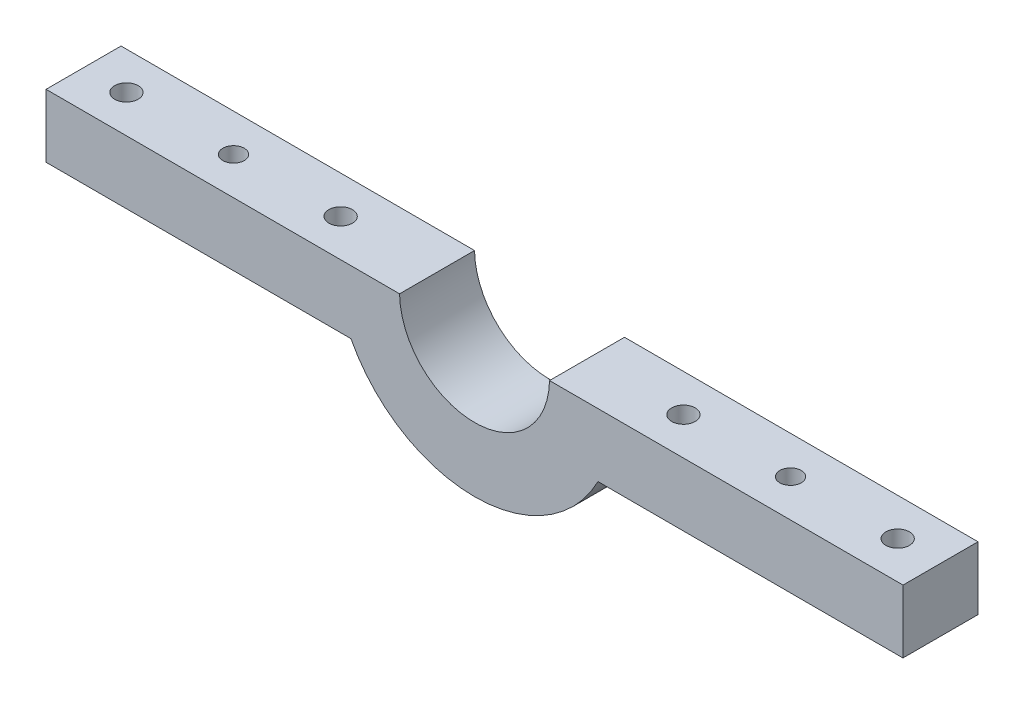
ISO-10303-21;
HEADER;
FILE_DESCRIPTION(('STEP AP214'),'2;1');
FILE_NAME('part.step','',(''),(''),'','','');
FILE_SCHEMA(('AUTOMOTIVE_DESIGN { 1 0 10303 214 1 1 1 1 }'));
ENDSEC;
DATA;
#1=APPLICATION_CONTEXT('core data for automotive mechanical design processes');
#2=APPLICATION_PROTOCOL_DEFINITION('international standard','automotive_design',2000,#1);
#3=PRODUCT_CONTEXT('',#1,'mechanical');
#4=PRODUCT('Part','Part','',(#3));
#5=PRODUCT_RELATED_PRODUCT_CATEGORY('part','',(#4));
#6=PRODUCT_DEFINITION_FORMATION('','',#4);
#7=PRODUCT_DEFINITION_CONTEXT('part definition',#1,'design');
#8=PRODUCT_DEFINITION('design','',#6,#7);
#9=PRODUCT_DEFINITION_SHAPE('','',#8);
#10=(LENGTH_UNIT() NAMED_UNIT(*) SI_UNIT(.MILLI.,.METRE.));
#11=(NAMED_UNIT(*) PLANE_ANGLE_UNIT() SI_UNIT($,.RADIAN.));
#12=(NAMED_UNIT(*) SI_UNIT($,.STERADIAN.) SOLID_ANGLE_UNIT());
#13=UNCERTAINTY_MEASURE_WITH_UNIT(LENGTH_MEASURE(1.E-05),#10,'distance_accuracy_value','');
#14=(GEOMETRIC_REPRESENTATION_CONTEXT(3) GLOBAL_UNCERTAINTY_ASSIGNED_CONTEXT((#13)) GLOBAL_UNIT_ASSIGNED_CONTEXT((#10,
#11,#12)) REPRESENTATION_CONTEXT('',''));
#15=CARTESIAN_POINT('',(0.,0.,0.));
#16=DIRECTION('',(0.,0.,1.));
#17=DIRECTION('',(1.,0.,0.));
#18=AXIS2_PLACEMENT_3D('',#15,#16,#17);
#19=CARTESIAN_POINT('',(0.00272792000566536,-239.807466490866,-35.));
#20=DIRECTION('',(0.,0.,1.));
#21=DIRECTION('',(1.,0.,0.));
#22=AXIS2_PLACEMENT_3D('',#19,#20,#21);
#23=PLANE('',#22);
#24=CARTESIAN_POINT('',(0.00272792000566536,-239.807466490866,-35.));
#25=DIRECTION('',(0.,0.,-1.));
#26=DIRECTION('',(1.,0.,0.));
#27=AXIS2_PLACEMENT_3D('',#24,#25,#26);
#28=CIRCLE('',#27,35.);
#29=CARTESIAN_POINT('',(-0.0972720799945216,-274.807323633431,-35.));
#30=VERTEX_POINT('',#29);
#31=CARTESIAN_POINT('',(-34.9941790972939,-240.27276126033,-35.));
#32=VERTEX_POINT('',#31);
#33=EDGE_CURVE('E143',#30,#32,#28,.T.);
#34=ORIENTED_EDGE('',*,*,#33,.F.);
#35=DIRECTION('',(0.,-1.,0.));
#36=VECTOR('',#35,1.);
#37=CARTESIAN_POINT('',(-0.0972720799945175,-239.807466490866,-35.));
#38=LINE('',#37,#36);
#39=CARTESIAN_POINT('',(-0.0972720799945252,-304.807389567743,-35.));
#40=VERTEX_POINT('',#39);
#41=EDGE_CURVE('E46',#30,#40,#38,.T.);
#42=ORIENTED_EDGE('',*,*,#41,.T.);
#43=CARTESIAN_POINT('',(0.00272792000566536,-239.807466490866,-35.));
#44=DIRECTION('',(0.,0.,1.));
#45=DIRECTION('',(1.,0.,0.));
#46=AXIS2_PLACEMENT_3D('',#43,#44,#45);
#47=CIRCLE('',#46,65.);
#48=CARTESIAN_POINT('',(-57.6898068657538,-269.7502691318,-35.));
#49=VERTEX_POINT('',#48);
#50=EDGE_CURVE('E211',#49,#40,#47,.T.);
#51=ORIENTED_EDGE('',*,*,#50,.F.);
#52=DIRECTION('',(0.999999508293016,-0.000991672187112033,0.));
#53=VECTOR('',#52,1.);
#54=CARTESIAN_POINT('',(-57.6898068657538,-269.7502691318,-35.));
#55=LINE('',#54,#53);
#56=CARTESIAN_POINT('',(-200.026923904211,-269.609117302234,-35.));
#57=VERTEX_POINT('',#56);
#58=EDGE_CURVE('E229',#57,#49,#55,.T.);
#59=ORIENTED_EDGE('',*,*,#58,.F.);
#60=DIRECTION('',(-0.00099167218711209,-0.999999508293016,0.));
#61=VECTOR('',#60,1.);
#62=CARTESIAN_POINT('',(-200.026923904211,-269.609117302234,-35.));
#63=LINE('',#62,#61);
#64=CARTESIAN_POINT('',(-199.997669574691,-240.10913180759,-35.));
#65=VERTEX_POINT('',#64);
#66=EDGE_CURVE('E175',#65,#57,#63,.T.);
#67=ORIENTED_EDGE('',*,*,#66,.F.);
#68=DIRECTION('',(-0.999999508293016,0.000991672187112086,0.));
#69=VECTOR('',#68,1.);
#70=CARTESIAN_POINT('',(-199.997669574691,-240.10913180759,-35.));
#71=LINE('',#70,#69);
#72=EDGE_CURVE('E142',#32,#65,#71,.T.);
#73=ORIENTED_EDGE('',*,*,#72,.F.);
#74=EDGE_LOOP('',(#34,#42,#51,#59,#67,#73));
#75=FACE_BOUND('',#74,.T.);
#76=ADVANCED_FACE('F38',(#75),#23,.F.);
#77=CARTESIAN_POINT('',(-200.026923904211,-269.609117302234,-35.));
#78=DIRECTION('',(-0.999999508293016,0.00099167218711209,0.));
#79=DIRECTION('',(-0.00099167218711209,-0.999999508293016,0.));
#80=AXIS2_PLACEMENT_3D('',#77,#78,#79);
#81=PLANE('',#80);
#82=DIRECTION('',(-0.00099167218711209,-0.999999508293016,0.));
#83=VECTOR('',#82,1.);
#84=CARTESIAN_POINT('',(-200.026923904211,-269.609117302234,0.));
#85=LINE('',#84,#83);
#86=CARTESIAN_POINT('',(-199.997669574691,-240.10913180759,0.));
#87=VERTEX_POINT('',#86);
#88=CARTESIAN_POINT('',(-200.026923904211,-269.609117302234,0.));
#89=VERTEX_POINT('',#88);
#90=EDGE_CURVE('E153',#87,#89,#85,.T.);
#91=ORIENTED_EDGE('',*,*,#90,.F.);
#92=DIRECTION('',(0.,0.,1.));
#93=VECTOR('',#92,1.);
#94=CARTESIAN_POINT('',(-199.997669574691,-240.10913180759,-35.));
#95=LINE('',#94,#93);
#96=EDGE_CURVE('E62',#65,#87,#95,.T.);
#97=ORIENTED_EDGE('',*,*,#96,.F.);
#98=ORIENTED_EDGE('',*,*,#66,.T.);
#99=DIRECTION('',(0.,0.,1.));
#100=VECTOR('',#99,1.);
#101=CARTESIAN_POINT('',(-200.026923904211,-269.609117302234,-35.));
#102=LINE('',#101,#100);
#103=EDGE_CURVE('E101',#57,#89,#102,.T.);
#104=ORIENTED_EDGE('',*,*,#103,.T.);
#105=EDGE_LOOP('',(#91,#97,#98,#104));
#106=FACE_BOUND('',#105,.T.);
#107=ADVANCED_FACE('F40',(#106),#81,.T.);
#108=CARTESIAN_POINT('',(-199.997669574691,-240.10913180759,-35.));
#109=DIRECTION('',(0.000991672187112087,0.999999508293016,0.));
#110=DIRECTION('',(-0.999999508293016,0.000991672187112087,0.));
#111=AXIS2_PLACEMENT_3D('',#108,#109,#110);
#112=PLANE('',#111);
#113=CARTESIAN_POINT('',(-129.99770399418,-240.178548860687,-17.5));
#114=DIRECTION('',(0.000991672187112087,0.999999508293016,0.));
#115=DIRECTION('',(-0.999999508293016,0.000991672187112087,0.));
#116=AXIS2_PLACEMENT_3D('',#113,#114,#115);
#117=CIRCLE('',#116,4.99999999999999);
#118=CARTESIAN_POINT('',(-134.997701535645,-240.173590499752,-17.5));
#119=VERTEX_POINT('',#118);
#120=EDGE_CURVE('E197',#119,#119,#117,.T.);
#121=ORIENTED_EDGE('',*,*,#120,.F.);
#122=EDGE_LOOP('',(#121));
#123=FACE_BOUND('',#122,.T.);
#124=CARTESIAN_POINT('',(-179.997679408831,-240.128965251332,-17.5));
#125=DIRECTION('',(0.000991672187112085,0.999999508293016,0.));
#126=DIRECTION('',(-0.999999508293016,0.000991672187112085,0.));
#127=AXIS2_PLACEMENT_3D('',#124,#125,#126);
#128=CIRCLE('',#127,5.49999999999999);
#129=CARTESIAN_POINT('',(-185.497676704442,-240.123511054303,-17.5));
#130=VERTEX_POINT('',#129);
#131=EDGE_CURVE('E193',#130,#130,#128,.T.);
#132=ORIENTED_EDGE('',*,*,#131,.F.);
#133=EDGE_LOOP('',(#132));
#134=FACE_BOUND('',#133,.T.);
#135=CARTESIAN_POINT('',(-79.9977285795291,-240.228132470043,-17.5));
#136=DIRECTION('',(0.000991672187112085,0.999999508293016,0.));
#137=DIRECTION('',(-0.999999508293016,0.000991672187112085,0.));
#138=AXIS2_PLACEMENT_3D('',#135,#136,#137);
#139=CIRCLE('',#138,5.49999999999999);
#140=CARTESIAN_POINT('',(-85.4977258751407,-240.222678273014,-17.5));
#141=VERTEX_POINT('',#140);
#142=EDGE_CURVE('E192',#141,#141,#139,.T.);
#143=ORIENTED_EDGE('',*,*,#142,.F.);
#144=EDGE_LOOP('',(#143));
#145=FACE_BOUND('',#144,.T.);
#146=DIRECTION('',(-0.999999508293016,0.000991672187112086,0.));
#147=VECTOR('',#146,1.);
#148=CARTESIAN_POINT('',(-199.997669574691,-240.10913180759,0.));
#149=LINE('',#148,#147);
#150=CARTESIAN_POINT('',(-34.9941790972939,-240.27276126033,0.));
#151=VERTEX_POINT('',#150);
#152=EDGE_CURVE('E172',#151,#87,#149,.T.);
#153=ORIENTED_EDGE('',*,*,#152,.F.);
#154=DIRECTION('',(0.,0.,1.));
#155=VECTOR('',#154,1.);
#156=CARTESIAN_POINT('',(-34.9941790972939,-240.27276126033,-35.));
#157=LINE('',#156,#155);
#158=EDGE_CURVE('E131',#32,#151,#157,.T.);
#159=ORIENTED_EDGE('',*,*,#158,.F.);
#160=ORIENTED_EDGE('',*,*,#72,.T.);
#161=ORIENTED_EDGE('',*,*,#96,.T.);
#162=EDGE_LOOP('',(#153,#159,#160,#161));
#163=FACE_BOUND('',#162,.T.);
#164=ADVANCED_FACE('F299',(#123,#134,#145,#163),#112,.T.);
#165=CARTESIAN_POINT('',(0.00272792000566536,-239.807466490866,-35.));
#166=DIRECTION('',(0.,0.,1.));
#167=DIRECTION('',(1.,0.,0.));
#168=AXIS2_PLACEMENT_3D('',#165,#166,#167);
#169=CYLINDRICAL_SURFACE('',#168,35.);
#170=DIRECTION('',(0.,0.,1.));
#171=VECTOR('',#170,1.);
#172=CARTESIAN_POINT('',(-0.0972720799945216,-274.807323633431,-35.));
#173=LINE('',#172,#171);
#174=CARTESIAN_POINT('',(-0.0972720799945216,-274.807323633431,-34.8));
#175=VERTEX_POINT('',#174);
#176=EDGE_CURVE('E265',#30,#175,#173,.T.);
#177=ORIENTED_EDGE('',*,*,#176,.F.);
#178=ORIENTED_EDGE('',*,*,#33,.T.);
#179=ORIENTED_EDGE('',*,*,#158,.T.);
#180=CARTESIAN_POINT('',(0.00272792000566536,-239.807466490866,0.));
#181=DIRECTION('',(0.,0.,-1.));
#182=DIRECTION('',(1.,0.,0.));
#183=AXIS2_PLACEMENT_3D('',#180,#181,#182);
#184=CIRCLE('',#183,35.);
#185=CARTESIAN_POINT('',(34.9986432651181,-240.342171229694,0.));
#186=VERTEX_POINT('',#185);
#187=EDGE_CURVE('E126',#186,#151,#184,.T.);
#188=ORIENTED_EDGE('',*,*,#187,.F.);
#189=DIRECTION('',(0.,0.,1.));
#190=VECTOR('',#189,1.);
#191=CARTESIAN_POINT('',(34.9986432651181,-240.342171229694,-35.));
#192=LINE('',#191,#190);
#193=CARTESIAN_POINT('',(34.9986432651181,-240.342171229694,-35.));
#194=VERTEX_POINT('',#193);
#195=EDGE_CURVE('E120',#194,#186,#192,.T.);
#196=ORIENTED_EDGE('',*,*,#195,.F.);
#197=CARTESIAN_POINT('',(0.102727920005478,-274.807323633431,-35.));
#198=VERTEX_POINT('',#197);
#199=EDGE_CURVE('E124',#194,#198,#28,.T.);
#200=ORIENTED_EDGE('',*,*,#199,.T.);
#201=DIRECTION('',(0.,0.,1.));
#202=VECTOR('',#201,1.);
#203=CARTESIAN_POINT('',(0.102727920005478,-274.807323633431,-35.));
#204=LINE('',#203,#202);
#205=CARTESIAN_POINT('',(0.102727920005478,-274.807323633431,-34.8));
#206=VERTEX_POINT('',#205);
#207=EDGE_CURVE('E53',#206,#198,#204,.F.);
#208=ORIENTED_EDGE('',*,*,#207,.F.);
#209=CARTESIAN_POINT('',(0.00272792000566536,-239.807466490866,-34.8));
#210=DIRECTION('',(0.,0.,1.));
#211=DIRECTION('',(1.,0.,0.));
#212=AXIS2_PLACEMENT_3D('',#209,#210,#211);
#213=CIRCLE('',#212,35.);
#214=EDGE_CURVE('E262',#175,#206,#213,.T.);
#215=ORIENTED_EDGE('',*,*,#214,.F.);
#216=EDGE_LOOP('',(#177,#178,#179,#188,#196,#200,#208,#215));
#217=FACE_BOUND('',#216,.T.);
#218=ADVANCED_FACE('F123',(#217),#169,.F.);
#219=CARTESIAN_POINT('',(34.9986432651181,-240.342171229694,-35.));
#220=DIRECTION('',(0.000991672187112086,0.999999508293016,0.));
#221=DIRECTION('',(-0.999999508293016,0.000991672187112086,0.));
#222=AXIS2_PLACEMENT_3D('',#219,#220,#221);
#223=PLANE('',#222);
#224=CARTESIAN_POINT('',(130.002168162004,-240.436383629337,-17.5));
#225=DIRECTION('',(0.000991672187112086,0.999999508293016,0.));
#226=DIRECTION('',(-0.999999508293016,0.000991672187112086,0.));
#227=AXIS2_PLACEMENT_3D('',#224,#225,#226);
#228=CIRCLE('',#227,4.99999999999999);
#229=CARTESIAN_POINT('',(125.002170620539,-240.431425268401,-17.5));
#230=VERTEX_POINT('',#229);
#231=EDGE_CURVE('E248',#230,#230,#228,.T.);
#232=ORIENTED_EDGE('',*,*,#231,.F.);
#233=EDGE_LOOP('',(#232));
#234=FACE_BOUND('',#233,.T.);
#235=CARTESIAN_POINT('',(80.0021927473534,-240.386800019981,-17.5));
#236=DIRECTION('',(0.000991672187112085,0.999999508293016,0.));
#237=DIRECTION('',(-0.999999508293016,0.000991672187112085,0.));
#238=AXIS2_PLACEMENT_3D('',#235,#236,#237);
#239=CIRCLE('',#238,5.49999999999999);
#240=CARTESIAN_POINT('',(74.5021954517418,-240.381345822952,-17.5));
#241=VERTEX_POINT('',#240);
#242=EDGE_CURVE('E238',#241,#241,#239,.T.);
#243=ORIENTED_EDGE('',*,*,#242,.F.);
#244=EDGE_LOOP('',(#243));
#245=FACE_BOUND('',#244,.T.);
#246=CARTESIAN_POINT('',(180.002143576655,-240.485967238692,-17.5));
#247=DIRECTION('',(0.000991672187112085,0.999999508293016,0.));
#248=DIRECTION('',(-0.999999508293016,0.000991672187112085,0.));
#249=AXIS2_PLACEMENT_3D('',#246,#247,#248);
#250=CIRCLE('',#249,5.49999999999999);
#251=CARTESIAN_POINT('',(174.502146281043,-240.480513041663,-17.5));
#252=VERTEX_POINT('',#251);
#253=EDGE_CURVE('E188',#252,#252,#250,.T.);
#254=ORIENTED_EDGE('',*,*,#253,.F.);
#255=EDGE_LOOP('',(#254));
#256=FACE_BOUND('',#255,.T.);
#257=DIRECTION('',(-0.999999508293016,0.000991672187112086,0.));
#258=VECTOR('',#257,1.);
#259=CARTESIAN_POINT('',(34.9986432651181,-240.342171229694,0.));
#260=LINE('',#259,#258);
#261=CARTESIAN_POINT('',(200.002133742515,-240.505800682434,0.));
#262=VERTEX_POINT('',#261);
#263=EDGE_CURVE('E169',#262,#186,#260,.T.);
#264=ORIENTED_EDGE('',*,*,#263,.F.);
#265=DIRECTION('',(0.,0.,1.));
#266=VECTOR('',#265,1.);
#267=CARTESIAN_POINT('',(200.002133742515,-240.505800682434,-35.));
#268=LINE('',#267,#266);
#269=CARTESIAN_POINT('',(200.002133742515,-240.505800682434,-35.));
#270=VERTEX_POINT('',#269);
#271=EDGE_CURVE('E132',#270,#262,#268,.T.);
#272=ORIENTED_EDGE('',*,*,#271,.F.);
#273=DIRECTION('',(-0.999999508293016,0.000991672187112086,0.));
#274=VECTOR('',#273,1.);
#275=CARTESIAN_POINT('',(34.9986432651181,-240.342171229694,-35.));
#276=LINE('',#275,#274);
#277=EDGE_CURVE('E139',#270,#194,#276,.T.);
#278=ORIENTED_EDGE('',*,*,#277,.T.);
#279=ORIENTED_EDGE('',*,*,#195,.T.);
#280=EDGE_LOOP('',(#264,#272,#278,#279));
#281=FACE_BOUND('',#280,.T.);
#282=ADVANCED_FACE('F145',(#234,#245,#256,#281),#223,.T.);
#283=CARTESIAN_POINT('',(200.002133742515,-240.505800682434,-35.));
#284=DIRECTION('',(0.999999508293016,-0.00099167218711209,0.));
#285=DIRECTION('',(0.00099167218711209,0.999999508293016,0.));
#286=AXIS2_PLACEMENT_3D('',#283,#284,#285);
#287=PLANE('',#286);
#288=DIRECTION('',(0.00099167218711209,0.999999508293016,0.));
#289=VECTOR('',#288,1.);
#290=CARTESIAN_POINT('',(200.002133742515,-240.505800682434,0.));
#291=LINE('',#290,#289);
#292=CARTESIAN_POINT('',(199.972879412995,-270.005786177078,0.));
#293=VERTEX_POINT('',#292);
#294=EDGE_CURVE('E166',#293,#262,#291,.T.);
#295=ORIENTED_EDGE('',*,*,#294,.F.);
#296=DIRECTION('',(0.,0.,1.));
#297=VECTOR('',#296,1.);
#298=CARTESIAN_POINT('',(199.972879412995,-270.005786177078,-35.));
#299=LINE('',#298,#297);
#300=CARTESIAN_POINT('',(199.972879412995,-270.005786177078,-35.));
#301=VERTEX_POINT('',#300);
#302=EDGE_CURVE('E179',#301,#293,#299,.T.);
#303=ORIENTED_EDGE('',*,*,#302,.F.);
#304=DIRECTION('',(0.00099167218711209,0.999999508293016,0.));
#305=VECTOR('',#304,1.);
#306=CARTESIAN_POINT('',(200.002133742515,-240.505800682434,-35.));
#307=LINE('',#306,#305);
#308=EDGE_CURVE('E146',#301,#270,#307,.T.);
#309=ORIENTED_EDGE('',*,*,#308,.T.);
#310=ORIENTED_EDGE('',*,*,#271,.T.);
#311=EDGE_LOOP('',(#295,#303,#309,#310));
#312=FACE_BOUND('',#311,.T.);
#313=ADVANCED_FACE('F332',(#312),#287,.T.);
#314=CARTESIAN_POINT('',(199.972879412995,-270.005786177078,-35.));
#315=DIRECTION('',(-0.000991672187112033,-0.999999508293016,0.));
#316=DIRECTION('',(0.999999508293016,-0.000991672187112033,0.));
#317=AXIS2_PLACEMENT_3D('',#314,#315,#316);
#318=PLANE('',#317);
#319=CARTESIAN_POINT('',(129.972913832484,-269.936369123981,-17.5));
#320=DIRECTION('',(-0.000991672187112031,-0.999999508293016,0.));
#321=DIRECTION('',(0.999999508293016,-0.000991672187112031,0.));
#322=AXIS2_PLACEMENT_3D('',#319,#320,#321);
#323=CIRCLE('',#322,5.49999999999999);
#324=CARTESIAN_POINT('',(135.472911128096,-269.94182332101,-17.5));
#325=VERTEX_POINT('',#324);
#326=EDGE_CURVE('E202',#325,#325,#323,.T.);
#327=ORIENTED_EDGE('',*,*,#326,.F.);
#328=EDGE_LOOP('',(#327));
#329=FACE_BOUND('',#328,.T.);
#330=CARTESIAN_POINT('',(79.9729384178336,-269.886785514625,-17.5));
#331=DIRECTION('',(-0.000991672187112033,-0.999999508293016,0.));
#332=DIRECTION('',(0.999999508293016,-0.000991672187112033,0.));
#333=AXIS2_PLACEMENT_3D('',#330,#331,#332);
#334=CIRCLE('',#333,5.49999999999999);
#335=CARTESIAN_POINT('',(85.4729357134452,-269.892239711654,-17.5));
#336=VERTEX_POINT('',#335);
#337=EDGE_CURVE('E235',#336,#336,#334,.T.);
#338=ORIENTED_EDGE('',*,*,#337,.F.);
#339=EDGE_LOOP('',(#338));
#340=FACE_BOUND('',#339,.T.);
#341=CARTESIAN_POINT('',(179.972889247135,-269.985952733336,-17.5));
#342=DIRECTION('',(-0.000991672187112033,-0.999999508293016,0.));
#343=DIRECTION('',(0.999999508293016,-0.000991672187112033,0.));
#344=AXIS2_PLACEMENT_3D('',#341,#342,#343);
#345=CIRCLE('',#344,5.49999999999999);
#346=CARTESIAN_POINT('',(185.472886542747,-269.991406930365,-17.5));
#347=VERTEX_POINT('',#346);
#348=EDGE_CURVE('E157',#347,#347,#345,.T.);
#349=ORIENTED_EDGE('',*,*,#348,.F.);
#350=EDGE_LOOP('',(#349));
#351=FACE_BOUND('',#350,.T.);
#352=DIRECTION('',(0.999999508293016,-0.000991672187112033,0.));
#353=VECTOR('',#352,1.);
#354=CARTESIAN_POINT('',(199.972879412995,-270.005786177078,0.));
#355=LINE('',#354,#353);
#356=CARTESIAN_POINT('',(57.6357623745385,-269.864634347512,0.));
#357=VERTEX_POINT('',#356);
#358=EDGE_CURVE('E163',#357,#293,#355,.T.);
#359=ORIENTED_EDGE('',*,*,#358,.F.);
#360=DIRECTION('',(0.,0.,1.));
#361=VECTOR('',#360,1.);
#362=CARTESIAN_POINT('',(57.6357623745385,-269.864634347512,-35.));
#363=LINE('',#362,#361);
#364=CARTESIAN_POINT('',(57.6357623745385,-269.864634347512,-35.));
#365=VERTEX_POINT('',#364);
#366=EDGE_CURVE('E181',#365,#357,#363,.T.);
#367=ORIENTED_EDGE('',*,*,#366,.F.);
#368=DIRECTION('',(0.999999508293016,-0.000991672187112033,0.));
#369=VECTOR('',#368,1.);
#370=CARTESIAN_POINT('',(199.972879412995,-270.005786177078,-35.));
#371=LINE('',#370,#369);
#372=EDGE_CURVE('E148',#365,#301,#371,.T.);
#373=ORIENTED_EDGE('',*,*,#372,.T.);
#374=ORIENTED_EDGE('',*,*,#302,.T.);
#375=EDGE_LOOP('',(#359,#367,#373,#374));
#376=FACE_BOUND('',#375,.T.);
#377=ADVANCED_FACE('F293',(#329,#340,#351,#376),#318,.T.);
#378=CARTESIAN_POINT('',(0.00272792000566536,-239.807466490866,-35.));
#379=DIRECTION('',(0.,0.,1.));
#380=DIRECTION('',(1.,0.,0.));
#381=AXIS2_PLACEMENT_3D('',#378,#379,#380);
#382=CYLINDRICAL_SURFACE('',#381,65.);
#383=DIRECTION('',(0.,0.,1.));
#384=VECTOR('',#383,1.);
#385=CARTESIAN_POINT('',(-0.0972720799945252,-304.807389567743,-35.));
#386=LINE('',#385,#384);
#387=CARTESIAN_POINT('',(-0.0972720799945252,-304.807389567743,-34.8));
#388=VERTEX_POINT('',#387);
#389=EDGE_CURVE('E224',#388,#40,#386,.F.);
#390=ORIENTED_EDGE('',*,*,#389,.F.);
#391=CARTESIAN_POINT('',(0.00272792000566536,-239.807466490866,-34.8));
#392=DIRECTION('',(0.,0.,1.));
#393=DIRECTION('',(1.,0.,0.));
#394=AXIS2_PLACEMENT_3D('',#391,#392,#393);
#395=CIRCLE('',#394,65.);
#396=CARTESIAN_POINT('',(0.102727920005475,-304.807389567743,-34.8));
#397=VERTEX_POINT('',#396);
#398=EDGE_CURVE('E11',#397,#388,#395,.F.);
#399=ORIENTED_EDGE('',*,*,#398,.F.);
#400=DIRECTION('',(0.,0.,1.));
#401=VECTOR('',#400,1.);
#402=CARTESIAN_POINT('',(0.102727920005475,-304.807389567743,-35.));
#403=LINE('',#402,#401);
#404=CARTESIAN_POINT('',(0.102727920005475,-304.807389567743,-35.));
#405=VERTEX_POINT('',#404);
#406=EDGE_CURVE('E269',#405,#397,#403,.T.);
#407=ORIENTED_EDGE('',*,*,#406,.F.);
#408=EDGE_CURVE('E226',#405,#365,#47,.T.);
#409=ORIENTED_EDGE('',*,*,#408,.T.);
#410=ORIENTED_EDGE('',*,*,#366,.T.);
#411=CARTESIAN_POINT('',(0.00272792000566536,-239.807466490866,0.));
#412=DIRECTION('',(0.,0.,1.));
#413=DIRECTION('',(1.,0.,0.));
#414=AXIS2_PLACEMENT_3D('',#411,#412,#413);
#415=CIRCLE('',#414,65.);
#416=CARTESIAN_POINT('',(-57.6898068657538,-269.7502691318,0.));
#417=VERTEX_POINT('',#416);
#418=EDGE_CURVE('E160',#417,#357,#415,.T.);
#419=ORIENTED_EDGE('',*,*,#418,.F.);
#420=DIRECTION('',(0.,0.,1.));
#421=VECTOR('',#420,1.);
#422=CARTESIAN_POINT('',(-57.6898068657538,-269.7502691318,-35.));
#423=LINE('',#422,#421);
#424=EDGE_CURVE('E183',#49,#417,#423,.T.);
#425=ORIENTED_EDGE('',*,*,#424,.F.);
#426=ORIENTED_EDGE('',*,*,#50,.T.);
#427=EDGE_LOOP('',(#390,#399,#407,#409,#410,#419,#425,#426));
#428=FACE_BOUND('',#427,.T.);
#429=ADVANCED_FACE('F221',(#428),#382,.T.);
#430=CARTESIAN_POINT('',(-57.6898068657538,-269.7502691318,-35.));
#431=DIRECTION('',(-0.000991672187112033,-0.999999508293016,0.));
#432=DIRECTION('',(0.999999508293016,-0.000991672187112033,0.));
#433=AXIS2_PLACEMENT_3D('',#430,#431,#432);
#434=PLANE('',#433);
#435=CARTESIAN_POINT('',(-130.0269583237,-269.678534355332,-17.5));
#436=DIRECTION('',(-0.000991672187112031,-0.999999508293016,0.));
#437=DIRECTION('',(0.999999508293016,-0.000991672187112031,0.));
#438=AXIS2_PLACEMENT_3D('',#435,#436,#437);
#439=CIRCLE('',#438,5.49999999999999);
#440=CARTESIAN_POINT('',(-124.526961028088,-269.683988552361,-17.5));
#441=VERTEX_POINT('',#440);
#442=EDGE_CURVE('E259',#441,#441,#439,.T.);
#443=ORIENTED_EDGE('',*,*,#442,.F.);
#444=EDGE_LOOP('',(#443));
#445=FACE_BOUND('',#444,.T.);
#446=CARTESIAN_POINT('',(-180.026933738351,-269.628950745976,-17.5));
#447=DIRECTION('',(-0.000991672187112033,-0.999999508293016,0.));
#448=DIRECTION('',(0.999999508293016,-0.000991672187112033,0.));
#449=AXIS2_PLACEMENT_3D('',#446,#447,#448);
#450=CIRCLE('',#449,5.49999999999999);
#451=CARTESIAN_POINT('',(-174.526936442739,-269.634404943005,-17.5));
#452=VERTEX_POINT('',#451);
#453=EDGE_CURVE('E189',#452,#452,#450,.T.);
#454=ORIENTED_EDGE('',*,*,#453,.F.);
#455=EDGE_LOOP('',(#454));
#456=FACE_BOUND('',#455,.T.);
#457=CARTESIAN_POINT('',(-80.0269829090489,-269.728117964687,-17.5));
#458=DIRECTION('',(-0.000991672187112033,-0.999999508293016,0.));
#459=DIRECTION('',(0.999999508293016,-0.000991672187112033,0.));
#460=AXIS2_PLACEMENT_3D('',#457,#458,#459);
#461=CIRCLE('',#460,5.49999999999999);
#462=CARTESIAN_POINT('',(-74.5269856134374,-269.733572161716,-17.5));
#463=VERTEX_POINT('',#462);
#464=EDGE_CURVE('E241',#463,#463,#461,.T.);
#465=ORIENTED_EDGE('',*,*,#464,.F.);
#466=EDGE_LOOP('',(#465));
#467=FACE_BOUND('',#466,.T.);
#468=DIRECTION('',(0.999999508293016,-0.000991672187112033,0.));
#469=VECTOR('',#468,1.);
#470=CARTESIAN_POINT('',(-57.6898068657538,-269.7502691318,0.));
#471=LINE('',#470,#469);
#472=EDGE_CURVE('E156',#89,#417,#471,.T.);
#473=ORIENTED_EDGE('',*,*,#472,.F.);
#474=ORIENTED_EDGE('',*,*,#103,.F.);
#475=ORIENTED_EDGE('',*,*,#58,.T.);
#476=ORIENTED_EDGE('',*,*,#424,.T.);
#477=EDGE_LOOP('',(#473,#474,#475,#476));
#478=FACE_BOUND('',#477,.T.);
#479=ADVANCED_FACE('F297',(#445,#456,#467,#478),#434,.T.);
#480=ORIENTED_EDGE('',*,*,#408,.F.);
#481=DIRECTION('',(0.,1.,0.));
#482=VECTOR('',#481,1.);
#483=CARTESIAN_POINT('',(0.102727920005481,-239.807466490866,-35.));
#484=LINE('',#483,#482);
#485=EDGE_CURVE('E141',#405,#198,#484,.T.);
#486=ORIENTED_EDGE('',*,*,#485,.T.);
#487=ORIENTED_EDGE('',*,*,#199,.F.);
#488=ORIENTED_EDGE('',*,*,#277,.F.);
#489=ORIENTED_EDGE('',*,*,#308,.F.);
#490=ORIENTED_EDGE('',*,*,#372,.F.);
#491=EDGE_LOOP('',(#480,#486,#487,#488,#489,#490));
#492=FACE_BOUND('',#491,.T.);
#493=ADVANCED_FACE('F137',(#492),#23,.F.);
#494=CARTESIAN_POINT('',(0.00272792000566536,-239.807466490866,0.));
#495=DIRECTION('',(0.,0.,1.));
#496=DIRECTION('',(1.,0.,0.));
#497=AXIS2_PLACEMENT_3D('',#494,#495,#496);
#498=PLANE('',#497);
#499=ORIENTED_EDGE('',*,*,#90,.T.);
#500=ORIENTED_EDGE('',*,*,#472,.T.);
#501=ORIENTED_EDGE('',*,*,#418,.T.);
#502=ORIENTED_EDGE('',*,*,#358,.T.);
#503=ORIENTED_EDGE('',*,*,#294,.T.);
#504=ORIENTED_EDGE('',*,*,#263,.T.);
#505=ORIENTED_EDGE('',*,*,#187,.T.);
#506=ORIENTED_EDGE('',*,*,#152,.T.);
#507=EDGE_LOOP('',(#499,#500,#501,#502,#503,#504,#505,#506));
#508=FACE_BOUND('',#507,.T.);
#509=ADVANCED_FACE('F296',(#508),#498,.T.);
#510=CARTESIAN_POINT('',(180.002143576655,-240.485967238692,-17.5));
#511=DIRECTION('',(0.000991672187112085,0.999999508293016,0.));
#512=DIRECTION('',(-0.999999508293016,0.000991672187112085,0.));
#513=AXIS2_PLACEMENT_3D('',#510,#511,#512);
#514=CYLINDRICAL_SURFACE('',#513,5.49999999999999);
#515=ORIENTED_EDGE('',*,*,#348,.T.);
#516=EDGE_LOOP('',(#515));
#517=FACE_BOUND('',#516,.T.);
#518=ORIENTED_EDGE('',*,*,#253,.T.);
#519=EDGE_LOOP('',(#518));
#520=FACE_BOUND('',#519,.T.);
#521=ADVANCED_FACE('F321',(#517,#520),#514,.F.);
#522=CARTESIAN_POINT('',(80.0021927473534,-240.386800019981,-17.5));
#523=DIRECTION('',(0.000991672187112085,0.999999508293016,0.));
#524=DIRECTION('',(-0.999999508293016,0.000991672187112085,0.));
#525=AXIS2_PLACEMENT_3D('',#522,#523,#524);
#526=CYLINDRICAL_SURFACE('',#525,5.49999999999999);
#527=ORIENTED_EDGE('',*,*,#337,.T.);
#528=EDGE_LOOP('',(#527));
#529=FACE_BOUND('',#528,.T.);
#530=ORIENTED_EDGE('',*,*,#242,.T.);
#531=EDGE_LOOP('',(#530));
#532=FACE_BOUND('',#531,.T.);
#533=ADVANCED_FACE('F348',(#529,#532),#526,.F.);
#534=CARTESIAN_POINT('',(-79.9977285795291,-240.228132470043,-17.5));
#535=DIRECTION('',(0.000991672187112085,0.999999508293016,0.));
#536=DIRECTION('',(-0.999999508293016,0.000991672187112085,0.));
#537=AXIS2_PLACEMENT_3D('',#534,#535,#536);
#538=CYLINDRICAL_SURFACE('',#537,5.49999999999999);
#539=ORIENTED_EDGE('',*,*,#464,.T.);
#540=EDGE_LOOP('',(#539));
#541=FACE_BOUND('',#540,.T.);
#542=ORIENTED_EDGE('',*,*,#142,.T.);
#543=EDGE_LOOP('',(#542));
#544=FACE_BOUND('',#543,.T.);
#545=ADVANCED_FACE('F353',(#541,#544),#538,.F.);
#546=CARTESIAN_POINT('',(-179.997679408831,-240.128965251332,-17.5));
#547=DIRECTION('',(0.000991672187112085,0.999999508293016,0.));
#548=DIRECTION('',(-0.999999508293016,0.000991672187112085,0.));
#549=AXIS2_PLACEMENT_3D('',#546,#547,#548);
#550=CYLINDRICAL_SURFACE('',#549,5.49999999999999);
#551=ORIENTED_EDGE('',*,*,#453,.T.);
#552=EDGE_LOOP('',(#551));
#553=FACE_BOUND('',#552,.T.);
#554=ORIENTED_EDGE('',*,*,#131,.T.);
#555=EDGE_LOOP('',(#554));
#556=FACE_BOUND('',#555,.T.);
#557=ADVANCED_FACE('F359',(#553,#556),#550,.F.);
#558=CARTESIAN_POINT('',(129.972913832484,-269.936369123981,-17.5));
#559=DIRECTION('',(-0.000991672187112031,-0.999999508293016,0.));
#560=DIRECTION('',(0.999999508293016,-0.000991672187112031,0.));
#561=AXIS2_PLACEMENT_3D('',#558,#559,#560);
#562=CYLINDRICAL_SURFACE('',#561,4.99999999999999);
#563=CARTESIAN_POINT('',(129.983128482738,-259.63594387926,-17.5));
#564=DIRECTION('',(-0.000991672187112031,-0.999999508293016,0.));
#565=DIRECTION('',(0.999999508293016,-0.000991672187112031,0.));
#566=AXIS2_PLACEMENT_3D('',#563,#564,#565);
#567=CIRCLE('',#566,4.99999999999999);
#568=CARTESIAN_POINT('',(134.983126024203,-259.640902240196,-17.5));
#569=VERTEX_POINT('',#568);
#570=EDGE_CURVE('E194',#569,#569,#567,.T.);
#571=ORIENTED_EDGE('',*,*,#570,.T.);
#572=EDGE_LOOP('',(#571));
#573=FACE_BOUND('',#572,.T.);
#574=ORIENTED_EDGE('',*,*,#231,.T.);
#575=EDGE_LOOP('',(#574));
#576=FACE_BOUND('',#575,.T.);
#577=ADVANCED_FACE('F363',(#573,#576),#562,.F.);
#578=CARTESIAN_POINT('',(-130.0269583237,-269.678534355332,-17.5));
#579=DIRECTION('',(-0.000991672187112031,-0.999999508293016,0.));
#580=DIRECTION('',(0.999999508293016,-0.000991672187112031,0.));
#581=AXIS2_PLACEMENT_3D('',#578,#579,#580);
#582=CYLINDRICAL_SURFACE('',#581,4.99999999999999);
#583=CARTESIAN_POINT('',(-130.016743673447,-259.378109110611,-17.5));
#584=DIRECTION('',(-0.000991672187112031,-0.999999508293016,0.));
#585=DIRECTION('',(0.999999508293016,-0.000991672187112031,0.));
#586=AXIS2_PLACEMENT_3D('',#583,#584,#585);
#587=CIRCLE('',#586,4.99999999999999);
#588=CARTESIAN_POINT('',(-125.016746131981,-259.383067471547,-17.5));
#589=VERTEX_POINT('',#588);
#590=EDGE_CURVE('E199',#589,#589,#587,.T.);
#591=ORIENTED_EDGE('',*,*,#590,.T.);
#592=EDGE_LOOP('',(#591));
#593=FACE_BOUND('',#592,.T.);
#594=ORIENTED_EDGE('',*,*,#120,.T.);
#595=EDGE_LOOP('',(#594));
#596=FACE_BOUND('',#595,.T.);
#597=ADVANCED_FACE('F367',(#593,#596),#582,.F.);
#598=CARTESIAN_POINT('',(129.982830554356,-259.93637404105,-17.5));
#599=DIRECTION('',(-0.000991672187112031,-0.999999508293016,0.));
#600=DIRECTION('',(0.999999508293016,-0.000991672187112031,0.));
#601=AXIS2_PLACEMENT_3D('',#598,#599,#600);
#602=CONICAL_SURFACE('',#601,5.49999999999999,1.02974425867665);
#603=CARTESIAN_POINT('',(129.982830554356,-259.93637404105,-17.5));
#604=DIRECTION('',(-0.000991672187112031,-0.999999508293016,0.));
#605=DIRECTION('',(0.999999508293016,-0.000991672187112031,0.));
#606=AXIS2_PLACEMENT_3D('',#603,#604,#605);
#607=CIRCLE('',#606,5.49999999999999);
#608=CARTESIAN_POINT('',(135.482827849967,-259.94182823808,-17.5));
#609=VERTEX_POINT('',#608);
#610=EDGE_CURVE('E198',#609,#609,#607,.T.);
#611=ORIENTED_EDGE('',*,*,#610,.T.);
#612=EDGE_LOOP('',(#611));
#613=FACE_BOUND('',#612,.T.);
#614=ORIENTED_EDGE('',*,*,#570,.F.);
#615=EDGE_LOOP('',(#614));
#616=FACE_BOUND('',#615,.T.);
#617=ADVANCED_FACE('F371',(#613,#616),#602,.F.);
#618=CARTESIAN_POINT('',(129.972913832484,-269.936369123981,-17.5));
#619=DIRECTION('',(-0.000991672187112031,-0.999999508293016,0.));
#620=DIRECTION('',(0.999999508293016,-0.000991672187112031,0.));
#621=AXIS2_PLACEMENT_3D('',#618,#619,#620);
#622=CYLINDRICAL_SURFACE('',#621,5.49999999999999);
#623=ORIENTED_EDGE('',*,*,#610,.F.);
#624=EDGE_LOOP('',(#623));
#625=FACE_BOUND('',#624,.T.);
#626=ORIENTED_EDGE('',*,*,#326,.T.);
#627=EDGE_LOOP('',(#626));
#628=FACE_BOUND('',#627,.T.);
#629=ADVANCED_FACE('F375',(#625,#628),#622,.F.);
#630=CARTESIAN_POINT('',(-130.017041601829,-259.678539272401,-17.5));
#631=DIRECTION('',(-0.000991672187112031,-0.999999508293016,0.));
#632=DIRECTION('',(0.999999508293016,-0.000991672187112031,0.));
#633=AXIS2_PLACEMENT_3D('',#630,#631,#632);
#634=CONICAL_SURFACE('',#633,5.49999999999999,1.02974425867665);
#635=CARTESIAN_POINT('',(-130.017041601829,-259.678539272401,-17.5));
#636=DIRECTION('',(-0.000991672187112031,-0.999999508293016,0.));
#637=DIRECTION('',(0.999999508293016,-0.000991672187112031,0.));
#638=AXIS2_PLACEMENT_3D('',#635,#636,#637);
#639=CIRCLE('',#638,5.49999999999999);
#640=CARTESIAN_POINT('',(-124.517044306217,-259.683993469431,-17.5));
#641=VERTEX_POINT('',#640);
#642=EDGE_CURVE('E203',#641,#641,#639,.T.);
#643=ORIENTED_EDGE('',*,*,#642,.T.);
#644=EDGE_LOOP('',(#643));
#645=FACE_BOUND('',#644,.T.);
#646=ORIENTED_EDGE('',*,*,#590,.F.);
#647=EDGE_LOOP('',(#646));
#648=FACE_BOUND('',#647,.T.);
#649=ADVANCED_FACE('F379',(#645,#648),#634,.F.);
#650=CARTESIAN_POINT('',(-130.0269583237,-269.678534355332,-17.5));
#651=DIRECTION('',(-0.000991672187112031,-0.999999508293016,0.));
#652=DIRECTION('',(0.999999508293016,-0.000991672187112031,0.));
#653=AXIS2_PLACEMENT_3D('',#650,#651,#652);
#654=CYLINDRICAL_SURFACE('',#653,5.49999999999999);
#655=ORIENTED_EDGE('',*,*,#642,.F.);
#656=EDGE_LOOP('',(#655));
#657=FACE_BOUND('',#656,.T.);
#658=ORIENTED_EDGE('',*,*,#442,.T.);
#659=EDGE_LOOP('',(#658));
#660=FACE_BOUND('',#659,.T.);
#661=ADVANCED_FACE('F383',(#657,#660),#654,.F.);
#662=CARTESIAN_POINT('',(-0.0972720799945212,-271.496822560527,-34.8));
#663=DIRECTION('',(-1.,0.,0.));
#664=DIRECTION('',(0.,-1.,0.));
#665=AXIS2_PLACEMENT_3D('',#662,#663,#664);
#666=PLANE('',#665);
#667=ORIENTED_EDGE('',*,*,#176,.T.);
#668=DIRECTION('',(0.,1.,0.));
#669=VECTOR('',#668,1.);
#670=CARTESIAN_POINT('',(-0.0972720799945212,-271.496822560527,-34.8));
#671=LINE('',#670,#669);
#672=EDGE_CURVE('E275',#388,#175,#671,.T.);
#673=ORIENTED_EDGE('',*,*,#672,.F.);
#674=ORIENTED_EDGE('',*,*,#389,.T.);
#675=ORIENTED_EDGE('',*,*,#41,.F.);
#676=EDGE_LOOP('',(#667,#673,#674,#675));
#677=FACE_BOUND('',#676,.T.);
#678=ADVANCED_FACE('F387',(#677),#666,.F.);
#679=CARTESIAN_POINT('',(0.102727920005478,-271.496822560527,-34.8));
#680=DIRECTION('',(1.,0.,0.));
#681=DIRECTION('',(0.,1.,0.));
#682=AXIS2_PLACEMENT_3D('',#679,#680,#681);
#683=PLANE('',#682);
#684=ORIENTED_EDGE('',*,*,#207,.T.);
#685=ORIENTED_EDGE('',*,*,#485,.F.);
#686=ORIENTED_EDGE('',*,*,#406,.T.);
#687=DIRECTION('',(0.,-1.,0.));
#688=VECTOR('',#687,1.);
#689=CARTESIAN_POINT('',(0.102727920005478,-271.496822560527,-34.8));
#690=LINE('',#689,#688);
#691=EDGE_CURVE('E272',#206,#397,#690,.T.);
#692=ORIENTED_EDGE('',*,*,#691,.F.);
#693=EDGE_LOOP('',(#684,#685,#686,#692));
#694=FACE_BOUND('',#693,.T.);
#695=ADVANCED_FACE('F288',(#694),#683,.F.);
#696=CARTESIAN_POINT('',(0.,0.,-34.8));
#697=DIRECTION('',(0.,0.,1.));
#698=DIRECTION('',(1.,0.,0.));
#699=AXIS2_PLACEMENT_3D('',#696,#697,#698);
#700=PLANE('',#699);
#701=ORIENTED_EDGE('',*,*,#214,.T.);
#702=ORIENTED_EDGE('',*,*,#691,.T.);
#703=ORIENTED_EDGE('',*,*,#398,.T.);
#704=ORIENTED_EDGE('',*,*,#672,.T.);
#705=EDGE_LOOP('',(#701,#702,#703,#704));
#706=FACE_BOUND('',#705,.T.);
#707=ADVANCED_FACE('F280',(#706),#700,.F.);
#708=CLOSED_SHELL('',(#76,#107,#164,#218,#282,#313,#377,#429,#479,#493,#509,#521,#533,#545,#557,
#577,#597,#617,#629,#649,#661,#678,#695,#707));
#709=MANIFOLD_SOLID_BREP('B2',#708);
#710=ADVANCED_BREP_SHAPE_REPRESENTATION('',(#18,#709),#14);
#711=SHAPE_DEFINITION_REPRESENTATION(#9,#710);
ENDSEC;
END-ISO-10303-21;
